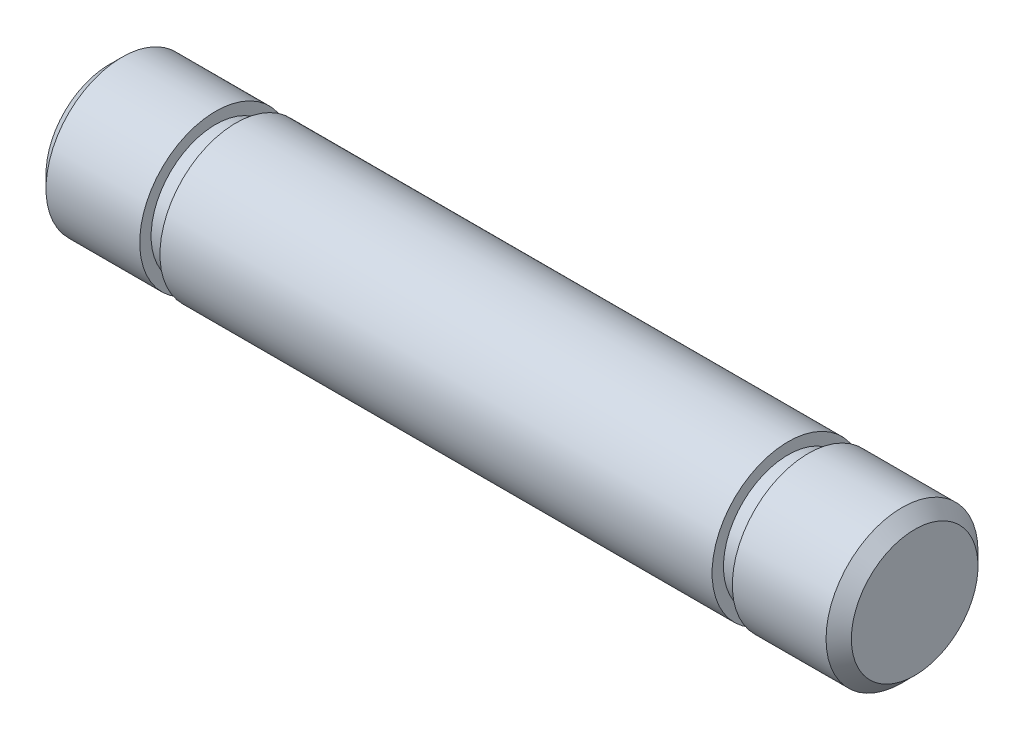
ISO-10303-21;
HEADER;
FILE_DESCRIPTION(('STEP AP214'),'2;1');
FILE_NAME('part.step','',(''),(''),'','','');
FILE_SCHEMA(('AUTOMOTIVE_DESIGN { 1 0 10303 214 1 1 1 1 }'));
ENDSEC;
DATA;
#1=APPLICATION_CONTEXT('core data for automotive mechanical design processes');
#2=APPLICATION_PROTOCOL_DEFINITION('international standard','automotive_design',2000,#1);
#3=PRODUCT_CONTEXT('',#1,'mechanical');
#4=PRODUCT('Part','Part','',(#3));
#5=PRODUCT_RELATED_PRODUCT_CATEGORY('part','',(#4));
#6=PRODUCT_DEFINITION_FORMATION('','',#4);
#7=PRODUCT_DEFINITION_CONTEXT('part definition',#1,'design');
#8=PRODUCT_DEFINITION('design','',#6,#7);
#9=PRODUCT_DEFINITION_SHAPE('','',#8);
#10=(LENGTH_UNIT() NAMED_UNIT(*) SI_UNIT(.MILLI.,.METRE.));
#11=(NAMED_UNIT(*) PLANE_ANGLE_UNIT() SI_UNIT($,.RADIAN.));
#12=(NAMED_UNIT(*) SI_UNIT($,.STERADIAN.) SOLID_ANGLE_UNIT());
#13=UNCERTAINTY_MEASURE_WITH_UNIT(LENGTH_MEASURE(1.E-05),#10,'distance_accuracy_value','');
#14=(GEOMETRIC_REPRESENTATION_CONTEXT(3) GLOBAL_UNCERTAINTY_ASSIGNED_CONTEXT((#13)) GLOBAL_UNIT_ASSIGNED_CONTEXT((#10,
#11,#12)) REPRESENTATION_CONTEXT('',''));
#15=CARTESIAN_POINT('',(0.,0.,0.));
#16=DIRECTION('',(0.,0.,1.));
#17=DIRECTION('',(1.,0.,0.));
#18=AXIS2_PLACEMENT_3D('',#15,#16,#17);
#19=CARTESIAN_POINT('',(15.9,0.,3.));
#20=DIRECTION('',(-1.,0.,0.));
#21=DIRECTION('',(0.,0.,1.));
#22=AXIS2_PLACEMENT_3D('',#19,#20,#21);
#23=PLANE('',#22);
#24=CARTESIAN_POINT('',(15.9,0.,0.));
#25=DIRECTION('',(-1.,0.,0.));
#26=DIRECTION('',(0.,0.,1.));
#27=AXIS2_PLACEMENT_3D('',#24,#25,#26);
#28=CIRCLE('',#27,2.5);
#29=CARTESIAN_POINT('',(15.9,0.,2.5));
#30=VERTEX_POINT('',#29);
#31=EDGE_CURVE('E68',#30,#30,#28,.F.);
#32=ORIENTED_EDGE('',*,*,#31,.T.);
#33=EDGE_LOOP('',(#32));
#34=FACE_BOUND('',#33,.T.);
#35=ADVANCED_FACE('F47',(#34),#23,.F.);
#36=CARTESIAN_POINT('',(-15.9,0.,3.));
#37=DIRECTION('',(1.,0.,0.));
#38=DIRECTION('',(0.,0.,-1.));
#39=AXIS2_PLACEMENT_3D('',#36,#37,#38);
#40=PLANE('',#39);
#41=CARTESIAN_POINT('',(-15.9,0.,0.));
#42=DIRECTION('',(1.,0.,0.));
#43=DIRECTION('',(0.,0.,-1.));
#44=AXIS2_PLACEMENT_3D('',#41,#42,#43);
#45=CIRCLE('',#44,2.50000000000001);
#46=CARTESIAN_POINT('',(-15.9,0.,-2.50000000000001));
#47=VERTEX_POINT('',#46);
#48=EDGE_CURVE('E10',#47,#47,#45,.F.);
#49=ORIENTED_EDGE('',*,*,#48,.T.);
#50=EDGE_LOOP('',(#49));
#51=FACE_BOUND('',#50,.T.);
#52=ADVANCED_FACE('F154',(#51),#40,.F.);
#53=CARTESIAN_POINT('',(15.9,0.,0.));
#54=DIRECTION('',(1.,0.,0.));
#55=DIRECTION('',(0.,0.,-1.));
#56=AXIS2_PLACEMENT_3D('',#53,#54,#55);
#57=CYLINDRICAL_SURFACE('',#56,3.);
#58=CARTESIAN_POINT('',(-15.4,0.,0.));
#59=DIRECTION('',(1.,0.,0.));
#60=DIRECTION('',(0.,0.,-1.));
#61=AXIS2_PLACEMENT_3D('',#58,#59,#60);
#62=CIRCLE('',#61,3.);
#63=CARTESIAN_POINT('',(-15.4,0.,-3.));
#64=VERTEX_POINT('',#63);
#65=EDGE_CURVE('E56',#64,#64,#62,.T.);
#66=ORIENTED_EDGE('',*,*,#65,.T.);
#67=EDGE_LOOP('',(#66));
#68=FACE_BOUND('',#67,.T.);
#69=CARTESIAN_POINT('',(-11.7,0.,0.));
#70=DIRECTION('',(1.,0.,0.));
#71=DIRECTION('',(0.,0.,-1.));
#72=AXIS2_PLACEMENT_3D('',#69,#70,#71);
#73=CIRCLE('',#72,3.);
#74=CARTESIAN_POINT('',(-11.7,0.,-3.));
#75=VERTEX_POINT('',#74);
#76=EDGE_CURVE('E74',#75,#75,#73,.T.);
#77=ORIENTED_EDGE('',*,*,#76,.F.);
#78=EDGE_LOOP('',(#77));
#79=FACE_BOUND('',#78,.T.);
#80=ADVANCED_FACE('F149',(#68,#79),#57,.T.);
#81=CARTESIAN_POINT('',(-11.7,0.,2.55));
#82=DIRECTION('',(-1.,0.,0.));
#83=DIRECTION('',(0.,0.,1.));
#84=AXIS2_PLACEMENT_3D('',#81,#82,#83);
#85=PLANE('',#84);
#86=CARTESIAN_POINT('',(-11.7,0.,0.));
#87=DIRECTION('',(1.,0.,0.));
#88=DIRECTION('',(0.,0.,-1.));
#89=AXIS2_PLACEMENT_3D('',#86,#87,#88);
#90=CIRCLE('',#89,2.55);
#91=CARTESIAN_POINT('',(-11.7,0.,-2.55));
#92=VERTEX_POINT('',#91);
#93=EDGE_CURVE('E78',#92,#92,#90,.T.);
#94=ORIENTED_EDGE('',*,*,#93,.F.);
#95=EDGE_LOOP('',(#94));
#96=FACE_BOUND('',#95,.T.);
#97=ORIENTED_EDGE('',*,*,#76,.T.);
#98=EDGE_LOOP('',(#97));
#99=FACE_BOUND('',#98,.T.);
#100=ADVANCED_FACE('F143',(#96,#99),#85,.F.);
#101=CARTESIAN_POINT('',(15.9,0.,0.));
#102=DIRECTION('',(1.,0.,0.));
#103=DIRECTION('',(0.,0.,-1.));
#104=AXIS2_PLACEMENT_3D('',#101,#102,#103);
#105=CYLINDRICAL_SURFACE('',#104,2.55);
#106=CARTESIAN_POINT('',(-10.9,0.,0.));
#107=DIRECTION('',(1.,0.,0.));
#108=DIRECTION('',(0.,0.,-1.));
#109=AXIS2_PLACEMENT_3D('',#106,#107,#108);
#110=CIRCLE('',#109,2.55);
#111=CARTESIAN_POINT('',(-10.9,0.,-2.55));
#112=VERTEX_POINT('',#111);
#113=EDGE_CURVE('E82',#112,#112,#110,.T.);
#114=ORIENTED_EDGE('',*,*,#113,.F.);
#115=EDGE_LOOP('',(#114));
#116=FACE_BOUND('',#115,.T.);
#117=ORIENTED_EDGE('',*,*,#93,.T.);
#118=EDGE_LOOP('',(#117));
#119=FACE_BOUND('',#118,.T.);
#120=ADVANCED_FACE('F137',(#116,#119),#105,.T.);
#121=CARTESIAN_POINT('',(-10.9,0.,3.));
#122=DIRECTION('',(1.,0.,0.));
#123=DIRECTION('',(0.,0.,-1.));
#124=AXIS2_PLACEMENT_3D('',#121,#122,#123);
#125=PLANE('',#124);
#126=CARTESIAN_POINT('',(-10.9,0.,0.));
#127=DIRECTION('',(1.,0.,0.));
#128=DIRECTION('',(0.,0.,-1.));
#129=AXIS2_PLACEMENT_3D('',#126,#127,#128);
#130=CIRCLE('',#129,3.);
#131=CARTESIAN_POINT('',(-10.9,0.,-3.));
#132=VERTEX_POINT('',#131);
#133=EDGE_CURVE('E86',#132,#132,#130,.T.);
#134=ORIENTED_EDGE('',*,*,#133,.F.);
#135=EDGE_LOOP('',(#134));
#136=FACE_BOUND('',#135,.T.);
#137=ORIENTED_EDGE('',*,*,#113,.T.);
#138=EDGE_LOOP('',(#137));
#139=FACE_BOUND('',#138,.T.);
#140=ADVANCED_FACE('F131',(#136,#139),#125,.F.);
#141=CARTESIAN_POINT('',(15.9,0.,0.));
#142=DIRECTION('',(1.,0.,0.));
#143=DIRECTION('',(0.,0.,-1.));
#144=AXIS2_PLACEMENT_3D('',#141,#142,#143);
#145=CYLINDRICAL_SURFACE('',#144,3.);
#146=CARTESIAN_POINT('',(10.9,0.,0.));
#147=DIRECTION('',(1.,0.,0.));
#148=DIRECTION('',(0.,0.,-1.));
#149=AXIS2_PLACEMENT_3D('',#146,#147,#148);
#150=CIRCLE('',#149,3.);
#151=CARTESIAN_POINT('',(10.9,0.,-3.));
#152=VERTEX_POINT('',#151);
#153=EDGE_CURVE('E90',#152,#152,#150,.T.);
#154=ORIENTED_EDGE('',*,*,#153,.F.);
#155=EDGE_LOOP('',(#154));
#156=FACE_BOUND('',#155,.T.);
#157=ORIENTED_EDGE('',*,*,#133,.T.);
#158=EDGE_LOOP('',(#157));
#159=FACE_BOUND('',#158,.T.);
#160=ADVANCED_FACE('F125',(#156,#159),#145,.T.);
#161=CARTESIAN_POINT('',(10.9,0.,3.));
#162=DIRECTION('',(-1.,0.,0.));
#163=DIRECTION('',(0.,0.,1.));
#164=AXIS2_PLACEMENT_3D('',#161,#162,#163);
#165=PLANE('',#164);
#166=CARTESIAN_POINT('',(10.9,0.,0.));
#167=DIRECTION('',(1.,0.,0.));
#168=DIRECTION('',(0.,0.,-1.));
#169=AXIS2_PLACEMENT_3D('',#166,#167,#168);
#170=CIRCLE('',#169,2.55);
#171=CARTESIAN_POINT('',(10.9,0.,-2.55));
#172=VERTEX_POINT('',#171);
#173=EDGE_CURVE('E94',#172,#172,#170,.T.);
#174=ORIENTED_EDGE('',*,*,#173,.F.);
#175=EDGE_LOOP('',(#174));
#176=FACE_BOUND('',#175,.T.);
#177=ORIENTED_EDGE('',*,*,#153,.T.);
#178=EDGE_LOOP('',(#177));
#179=FACE_BOUND('',#178,.T.);
#180=ADVANCED_FACE('F119',(#176,#179),#165,.F.);
#181=CARTESIAN_POINT('',(15.9,0.,0.));
#182=DIRECTION('',(1.,0.,0.));
#183=DIRECTION('',(0.,0.,-1.));
#184=AXIS2_PLACEMENT_3D('',#181,#182,#183);
#185=CYLINDRICAL_SURFACE('',#184,2.55);
#186=CARTESIAN_POINT('',(11.7,0.,0.));
#187=DIRECTION('',(1.,0.,0.));
#188=DIRECTION('',(0.,0.,-1.));
#189=AXIS2_PLACEMENT_3D('',#186,#187,#188);
#190=CIRCLE('',#189,2.55);
#191=CARTESIAN_POINT('',(11.7,0.,-2.55));
#192=VERTEX_POINT('',#191);
#193=EDGE_CURVE('E98',#192,#192,#190,.T.);
#194=ORIENTED_EDGE('',*,*,#193,.F.);
#195=EDGE_LOOP('',(#194));
#196=FACE_BOUND('',#195,.T.);
#197=ORIENTED_EDGE('',*,*,#173,.T.);
#198=EDGE_LOOP('',(#197));
#199=FACE_BOUND('',#198,.T.);
#200=ADVANCED_FACE('F113',(#196,#199),#185,.T.);
#201=CARTESIAN_POINT('',(11.7,0.,2.55));
#202=DIRECTION('',(1.,0.,0.));
#203=DIRECTION('',(0.,0.,-1.));
#204=AXIS2_PLACEMENT_3D('',#201,#202,#203);
#205=PLANE('',#204);
#206=CARTESIAN_POINT('',(11.7,0.,0.));
#207=DIRECTION('',(1.,0.,0.));
#208=DIRECTION('',(0.,0.,-1.));
#209=AXIS2_PLACEMENT_3D('',#206,#207,#208);
#210=CIRCLE('',#209,3.);
#211=CARTESIAN_POINT('',(11.7,0.,-3.));
#212=VERTEX_POINT('',#211);
#213=EDGE_CURVE('E102',#212,#212,#210,.T.);
#214=ORIENTED_EDGE('',*,*,#213,.F.);
#215=EDGE_LOOP('',(#214));
#216=FACE_BOUND('',#215,.T.);
#217=ORIENTED_EDGE('',*,*,#193,.T.);
#218=EDGE_LOOP('',(#217));
#219=FACE_BOUND('',#218,.T.);
#220=ADVANCED_FACE('F110',(#216,#219),#205,.F.);
#221=CARTESIAN_POINT('',(15.9,0.,0.));
#222=DIRECTION('',(1.,0.,0.));
#223=DIRECTION('',(0.,0.,-1.));
#224=AXIS2_PLACEMENT_3D('',#221,#222,#223);
#225=CYLINDRICAL_SURFACE('',#224,3.);
#226=CARTESIAN_POINT('',(15.4,0.,0.));
#227=DIRECTION('',(-1.,0.,0.));
#228=DIRECTION('',(0.,0.,1.));
#229=AXIS2_PLACEMENT_3D('',#226,#227,#228);
#230=CIRCLE('',#229,3.);
#231=CARTESIAN_POINT('',(15.4,0.,3.));
#232=VERTEX_POINT('',#231);
#233=EDGE_CURVE('E62',#232,#232,#230,.T.);
#234=ORIENTED_EDGE('',*,*,#233,.T.);
#235=EDGE_LOOP('',(#234));
#236=FACE_BOUND('',#235,.T.);
#237=ORIENTED_EDGE('',*,*,#213,.T.);
#238=EDGE_LOOP('',(#237));
#239=FACE_BOUND('',#238,.T.);
#240=ADVANCED_FACE('F108',(#236,#239),#225,.T.);
#241=CARTESIAN_POINT('',(15.9,0.,0.));
#242=DIRECTION('',(-1.,0.,0.));
#243=DIRECTION('',(0.,0.,1.));
#244=AXIS2_PLACEMENT_3D('',#241,#242,#243);
#245=CONICAL_SURFACE('',#244,2.5,0.785398163397445);
#246=ORIENTED_EDGE('',*,*,#233,.F.);
#247=EDGE_LOOP('',(#246));
#248=FACE_BOUND('',#247,.T.);
#249=ORIENTED_EDGE('',*,*,#31,.F.);
#250=EDGE_LOOP('',(#249));
#251=FACE_BOUND('',#250,.T.);
#252=ADVANCED_FACE('F167',(#248,#251),#245,.T.);
#253=CARTESIAN_POINT('',(-15.4,0.,0.));
#254=DIRECTION('',(1.,0.,0.));
#255=DIRECTION('',(0.,0.,-1.));
#256=AXIS2_PLACEMENT_3D('',#253,#254,#255);
#257=CONICAL_SURFACE('',#256,3.,0.785398163397449);
#258=ORIENTED_EDGE('',*,*,#48,.F.);
#259=EDGE_LOOP('',(#258));
#260=FACE_BOUND('',#259,.T.);
#261=ORIENTED_EDGE('',*,*,#65,.F.);
#262=EDGE_LOOP('',(#261));
#263=FACE_BOUND('',#262,.T.);
#264=ADVANCED_FACE('F50',(#260,#263),#257,.T.);
#265=CLOSED_SHELL('',(#35,#52,#80,#100,#120,#140,#160,#180,#200,#220,#240,#252,#264));
#266=MANIFOLD_SOLID_BREP('B2',#265);
#267=ADVANCED_BREP_SHAPE_REPRESENTATION('',(#18,#266),#14);
#268=SHAPE_DEFINITION_REPRESENTATION(#9,#267);
ENDSEC;
END-ISO-10303-21;
